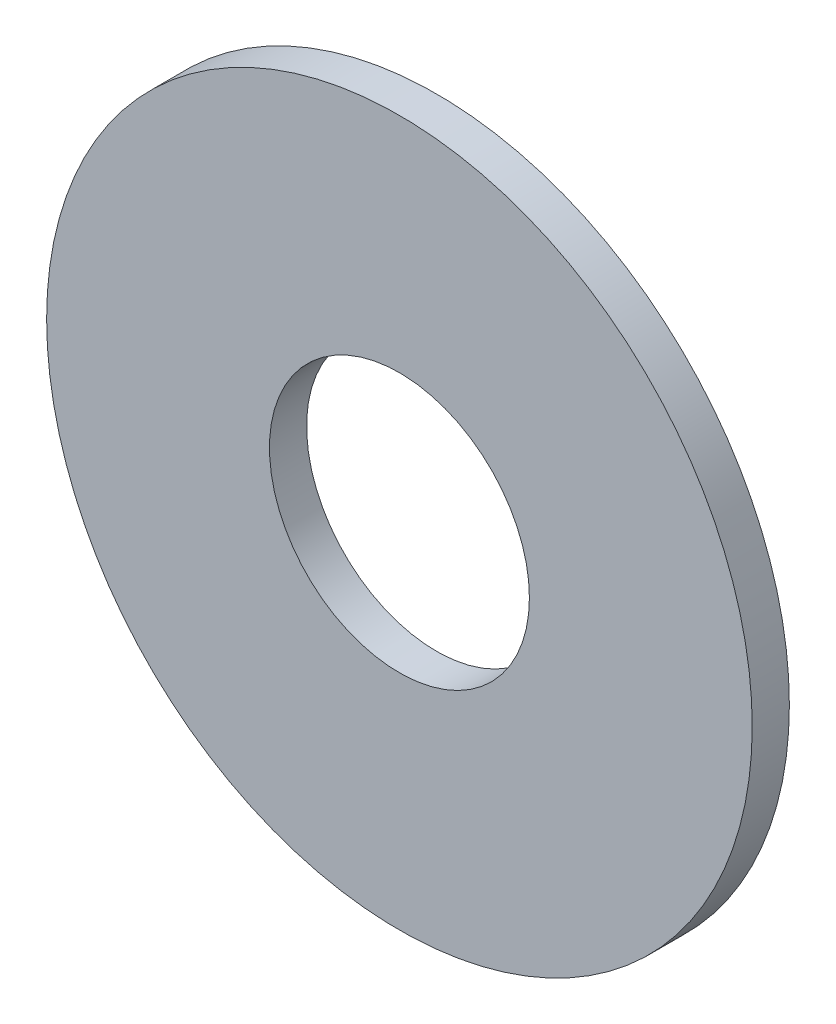
ISO-10303-21;
HEADER;
FILE_DESCRIPTION(('STEP AP214'),'2;1');
FILE_NAME('part.step','',(''),(''),'','','');
FILE_SCHEMA(('AUTOMOTIVE_DESIGN { 1 0 10303 214 1 1 1 1 }'));
ENDSEC;
DATA;
#1=APPLICATION_CONTEXT('core data for automotive mechanical design processes');
#2=APPLICATION_PROTOCOL_DEFINITION('international standard','automotive_design',2000,#1);
#3=PRODUCT_CONTEXT('',#1,'mechanical');
#4=PRODUCT('Part','Part','',(#3));
#5=PRODUCT_RELATED_PRODUCT_CATEGORY('part','',(#4));
#6=PRODUCT_DEFINITION_FORMATION('','',#4);
#7=PRODUCT_DEFINITION_CONTEXT('part definition',#1,'design');
#8=PRODUCT_DEFINITION('design','',#6,#7);
#9=PRODUCT_DEFINITION_SHAPE('','',#8);
#10=(LENGTH_UNIT() NAMED_UNIT(*) SI_UNIT(.MILLI.,.METRE.));
#11=(NAMED_UNIT(*) PLANE_ANGLE_UNIT() SI_UNIT($,.RADIAN.));
#12=(NAMED_UNIT(*) SI_UNIT($,.STERADIAN.) SOLID_ANGLE_UNIT());
#13=UNCERTAINTY_MEASURE_WITH_UNIT(LENGTH_MEASURE(1.E-05),#10,'distance_accuracy_value','');
#14=(GEOMETRIC_REPRESENTATION_CONTEXT(3) GLOBAL_UNCERTAINTY_ASSIGNED_CONTEXT((#13)) GLOBAL_UNIT_ASSIGNED_CONTEXT((#10,
#11,#12)) REPRESENTATION_CONTEXT('',''));
#15=CARTESIAN_POINT('',(0.,0.,0.));
#16=DIRECTION('',(0.,0.,1.));
#17=DIRECTION('',(1.,0.,0.));
#18=AXIS2_PLACEMENT_3D('',#15,#16,#17);
#19=CARTESIAN_POINT('',(0.,0.,0.5));
#20=DIRECTION('',(0.,0.,1.));
#21=DIRECTION('',(1.,0.,0.));
#22=AXIS2_PLACEMENT_3D('',#19,#20,#21);
#23=PLANE('',#22);
#24=CARTESIAN_POINT('',(0.,0.,0.5));
#25=DIRECTION('',(0.,0.,1.));
#26=DIRECTION('',(1.,0.,0.));
#27=AXIS2_PLACEMENT_3D('',#24,#25,#26);
#28=CIRCLE('',#27,4.75);
#29=CARTESIAN_POINT('',(4.75,0.,0.5));
#30=VERTEX_POINT('',#29);
#31=EDGE_CURVE('E10',#30,#30,#28,.T.);
#32=ORIENTED_EDGE('',*,*,#31,.T.);
#33=EDGE_LOOP('',(#32));
#34=FACE_BOUND('',#33,.T.);
#35=CARTESIAN_POINT('',(0.,0.,0.5));
#36=DIRECTION('',(0.,0.,1.));
#37=DIRECTION('',(1.,0.,0.));
#38=AXIS2_PLACEMENT_3D('',#35,#36,#37);
#39=CIRCLE('',#38,1.75);
#40=CARTESIAN_POINT('',(1.75,0.,0.5));
#41=VERTEX_POINT('',#40);
#42=EDGE_CURVE('E44',#41,#41,#39,.T.);
#43=ORIENTED_EDGE('',*,*,#42,.F.);
#44=EDGE_LOOP('',(#43));
#45=FACE_BOUND('',#44,.T.);
#46=ADVANCED_FACE('F33',(#34,#45),#23,.T.);
#47=CARTESIAN_POINT('',(0.,0.,0.));
#48=DIRECTION('',(0.,0.,1.));
#49=DIRECTION('',(1.,0.,0.));
#50=AXIS2_PLACEMENT_3D('',#47,#48,#49);
#51=PLANE('',#50);
#52=CARTESIAN_POINT('',(0.,0.,0.));
#53=DIRECTION('',(0.,0.,1.));
#54=DIRECTION('',(1.,0.,0.));
#55=AXIS2_PLACEMENT_3D('',#52,#53,#54);
#56=CIRCLE('',#55,4.75);
#57=CARTESIAN_POINT('',(4.75,0.,0.));
#58=VERTEX_POINT('',#57);
#59=EDGE_CURVE('E37',#58,#58,#56,.T.);
#60=ORIENTED_EDGE('',*,*,#59,.F.);
#61=EDGE_LOOP('',(#60));
#62=FACE_BOUND('',#61,.T.);
#63=CARTESIAN_POINT('',(0.,0.,0.));
#64=DIRECTION('',(0.,0.,1.));
#65=DIRECTION('',(1.,0.,0.));
#66=AXIS2_PLACEMENT_3D('',#63,#64,#65);
#67=CIRCLE('',#66,1.75);
#68=CARTESIAN_POINT('',(1.75,0.,0.));
#69=VERTEX_POINT('',#68);
#70=EDGE_CURVE('E46',#69,#69,#67,.T.);
#71=ORIENTED_EDGE('',*,*,#70,.T.);
#72=EDGE_LOOP('',(#71));
#73=FACE_BOUND('',#72,.T.);
#74=ADVANCED_FACE('F56',(#62,#73),#51,.F.);
#75=CARTESIAN_POINT('',(0.,0.,0.5));
#76=DIRECTION('',(0.,0.,-1.));
#77=DIRECTION('',(-1.,0.,0.));
#78=AXIS2_PLACEMENT_3D('',#75,#76,#77);
#79=CYLINDRICAL_SURFACE('',#78,4.75);
#80=ORIENTED_EDGE('',*,*,#31,.F.);
#81=EDGE_LOOP('',(#80));
#82=FACE_BOUND('',#81,.T.);
#83=ORIENTED_EDGE('',*,*,#59,.T.);
#84=EDGE_LOOP('',(#83));
#85=FACE_BOUND('',#84,.T.);
#86=ADVANCED_FACE('F35',(#82,#85),#79,.T.);
#87=CARTESIAN_POINT('',(0.,0.,0.5));
#88=DIRECTION('',(0.,0.,-1.));
#89=DIRECTION('',(-1.,0.,0.));
#90=AXIS2_PLACEMENT_3D('',#87,#88,#89);
#91=CYLINDRICAL_SURFACE('',#90,1.75);
#92=ORIENTED_EDGE('',*,*,#42,.T.);
#93=EDGE_LOOP('',(#92));
#94=FACE_BOUND('',#93,.T.);
#95=ORIENTED_EDGE('',*,*,#70,.F.);
#96=EDGE_LOOP('',(#95));
#97=FACE_BOUND('',#96,.T.);
#98=ADVANCED_FACE('F52',(#94,#97),#91,.F.);
#99=CLOSED_SHELL('',(#46,#74,#86,#98));
#100=MANIFOLD_SOLID_BREP('B2',#99);
#101=ADVANCED_BREP_SHAPE_REPRESENTATION('',(#18,#100),#14);
#102=SHAPE_DEFINITION_REPRESENTATION(#9,#101);
ENDSEC;
END-ISO-10303-21;
